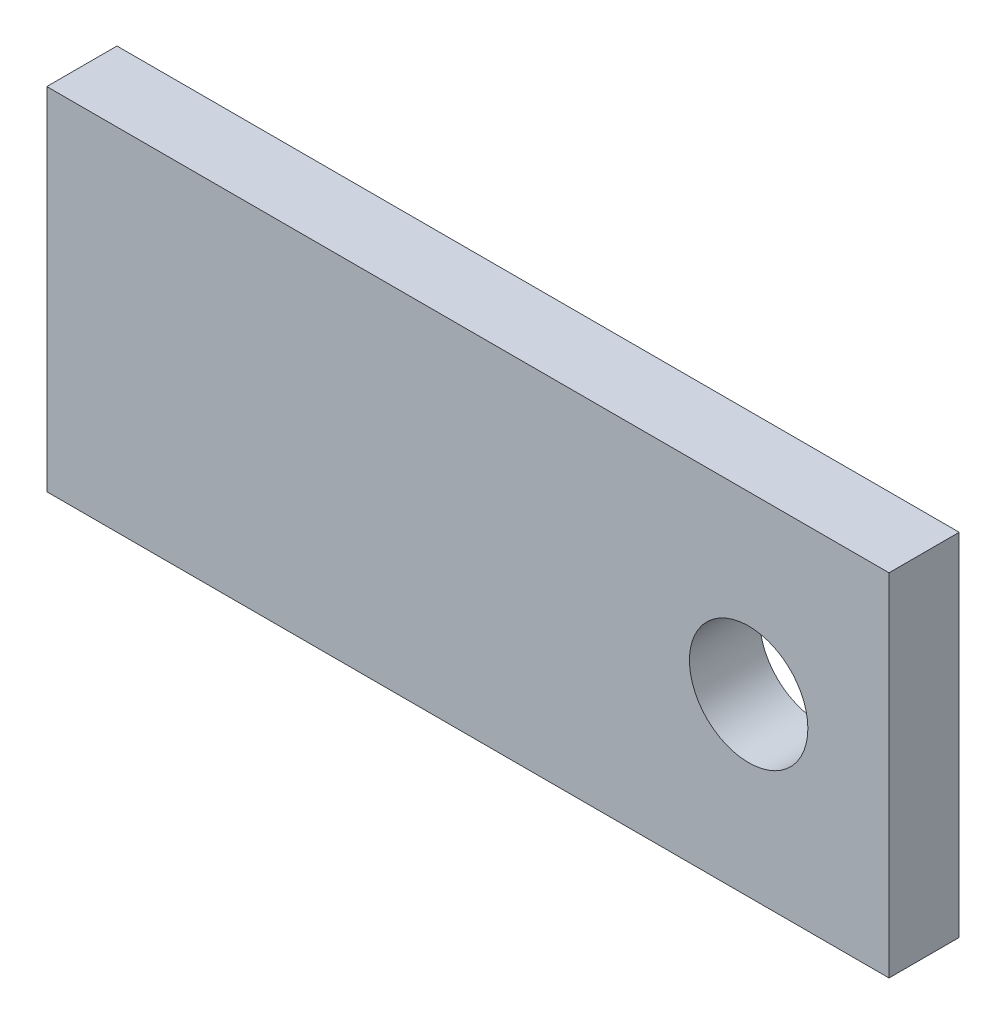
ISO-10303-21;
HEADER;
FILE_DESCRIPTION(('STEP AP214'),'2;1');
FILE_NAME('part.step','',(''),(''),'','','');
FILE_SCHEMA(('AUTOMOTIVE_DESIGN { 1 0 10303 214 1 1 1 1 }'));
ENDSEC;
DATA;
#1=APPLICATION_CONTEXT('core data for automotive mechanical design processes');
#2=APPLICATION_PROTOCOL_DEFINITION('international standard','automotive_design',2000,#1);
#3=PRODUCT_CONTEXT('',#1,'mechanical');
#4=PRODUCT('Part','Part','',(#3));
#5=PRODUCT_RELATED_PRODUCT_CATEGORY('part','',(#4));
#6=PRODUCT_DEFINITION_FORMATION('','',#4);
#7=PRODUCT_DEFINITION_CONTEXT('part definition',#1,'design');
#8=PRODUCT_DEFINITION('design','',#6,#7);
#9=PRODUCT_DEFINITION_SHAPE('','',#8);
#10=(LENGTH_UNIT() NAMED_UNIT(*) SI_UNIT(.MILLI.,.METRE.));
#11=(NAMED_UNIT(*) PLANE_ANGLE_UNIT() SI_UNIT($,.RADIAN.));
#12=(NAMED_UNIT(*) SI_UNIT($,.STERADIAN.) SOLID_ANGLE_UNIT());
#13=UNCERTAINTY_MEASURE_WITH_UNIT(LENGTH_MEASURE(1.E-05),#10,'distance_accuracy_value','');
#14=(GEOMETRIC_REPRESENTATION_CONTEXT(3) GLOBAL_UNCERTAINTY_ASSIGNED_CONTEXT((#13)) GLOBAL_UNIT_ASSIGNED_CONTEXT((#10,
#11,#12)) REPRESENTATION_CONTEXT('',''));
#15=CARTESIAN_POINT('',(0.,0.,0.));
#16=DIRECTION('',(0.,0.,1.));
#17=DIRECTION('',(1.,0.,0.));
#18=AXIS2_PLACEMENT_3D('',#15,#16,#17);
#19=CARTESIAN_POINT('',(38.1,-15.875,3.175));
#20=DIRECTION('',(-1.,0.,0.));
#21=DIRECTION('',(0.,0.,1.));
#22=AXIS2_PLACEMENT_3D('',#19,#20,#21);
#23=PLANE('',#22);
#24=DIRECTION('',(0.,1.,0.));
#25=VECTOR('',#24,1.);
#26=CARTESIAN_POINT('',(38.1,-15.875,-3.175));
#27=LINE('',#26,#25);
#28=CARTESIAN_POINT('',(38.1,-15.875,-3.175));
#29=VERTEX_POINT('',#28);
#30=CARTESIAN_POINT('',(38.1,15.875,-3.175));
#31=VERTEX_POINT('',#30);
#32=EDGE_CURVE('E96',#29,#31,#27,.T.);
#33=ORIENTED_EDGE('',*,*,#32,.T.);
#34=DIRECTION('',(0.,0.,-1.));
#35=VECTOR('',#34,1.);
#36=CARTESIAN_POINT('',(38.1,15.875,3.175));
#37=LINE('',#36,#35);
#38=CARTESIAN_POINT('',(38.1,15.875,3.175));
#39=VERTEX_POINT('',#38);
#40=EDGE_CURVE('E11',#39,#31,#37,.T.);
#41=ORIENTED_EDGE('',*,*,#40,.F.);
#42=DIRECTION('',(0.,1.,0.));
#43=VECTOR('',#42,1.);
#44=CARTESIAN_POINT('',(38.1,-15.875,3.175));
#45=LINE('',#44,#43);
#46=CARTESIAN_POINT('',(38.1,-15.875,3.175));
#47=VERTEX_POINT('',#46);
#48=EDGE_CURVE('E84',#47,#39,#45,.T.);
#49=ORIENTED_EDGE('',*,*,#48,.F.);
#50=DIRECTION('',(0.,0.,-1.));
#51=VECTOR('',#50,1.);
#52=CARTESIAN_POINT('',(38.1,-15.875,3.175));
#53=LINE('',#52,#51);
#54=EDGE_CURVE('E92',#47,#29,#53,.T.);
#55=ORIENTED_EDGE('',*,*,#54,.T.);
#56=EDGE_LOOP('',(#33,#41,#49,#55));
#57=FACE_BOUND('',#56,.T.);
#58=ADVANCED_FACE('F33',(#57),#23,.F.);
#59=CARTESIAN_POINT('',(-38.1,15.875,3.175));
#60=DIRECTION('',(0.,-1.,0.));
#61=DIRECTION('',(0.,0.,-1.));
#62=AXIS2_PLACEMENT_3D('',#59,#60,#61);
#63=PLANE('',#62);
#64=DIRECTION('',(-1.,0.,0.));
#65=VECTOR('',#64,1.);
#66=CARTESIAN_POINT('',(-38.1,15.875,-3.175));
#67=LINE('',#66,#65);
#68=CARTESIAN_POINT('',(-38.1,15.875,-3.175));
#69=VERTEX_POINT('',#68);
#70=EDGE_CURVE('E88',#31,#69,#67,.T.);
#71=ORIENTED_EDGE('',*,*,#70,.T.);
#72=DIRECTION('',(0.,0.,-1.));
#73=VECTOR('',#72,1.);
#74=CARTESIAN_POINT('',(-38.1,15.875,3.175));
#75=LINE('',#74,#73);
#76=CARTESIAN_POINT('',(-38.1,15.875,3.175));
#77=VERTEX_POINT('',#76);
#78=EDGE_CURVE('E41',#77,#69,#75,.T.);
#79=ORIENTED_EDGE('',*,*,#78,.F.);
#80=DIRECTION('',(-1.,0.,0.));
#81=VECTOR('',#80,1.);
#82=CARTESIAN_POINT('',(-38.1,15.875,3.175));
#83=LINE('',#82,#81);
#84=EDGE_CURVE('E79',#39,#77,#83,.T.);
#85=ORIENTED_EDGE('',*,*,#84,.F.);
#86=ORIENTED_EDGE('',*,*,#40,.T.);
#87=EDGE_LOOP('',(#71,#79,#85,#86));
#88=FACE_BOUND('',#87,.T.);
#89=ADVANCED_FACE('F87',(#88),#63,.F.);
#90=CARTESIAN_POINT('',(-38.1,-15.875,3.175));
#91=DIRECTION('',(1.,0.,0.));
#92=DIRECTION('',(0.,0.,-1.));
#93=AXIS2_PLACEMENT_3D('',#90,#91,#92);
#94=PLANE('',#93);
#95=DIRECTION('',(0.,-1.,0.));
#96=VECTOR('',#95,1.);
#97=CARTESIAN_POINT('',(-38.1,-15.875,-3.175));
#98=LINE('',#97,#96);
#99=CARTESIAN_POINT('',(-38.1,-15.875,-3.175));
#100=VERTEX_POINT('',#99);
#101=EDGE_CURVE('E66',#69,#100,#98,.T.);
#102=ORIENTED_EDGE('',*,*,#101,.T.);
#103=DIRECTION('',(0.,0.,-1.));
#104=VECTOR('',#103,1.);
#105=CARTESIAN_POINT('',(-38.1,-15.875,3.175));
#106=LINE('',#105,#104);
#107=CARTESIAN_POINT('',(-38.1,-15.875,3.175));
#108=VERTEX_POINT('',#107);
#109=EDGE_CURVE('E89',#108,#100,#106,.T.);
#110=ORIENTED_EDGE('',*,*,#109,.F.);
#111=DIRECTION('',(0.,-1.,0.));
#112=VECTOR('',#111,1.);
#113=CARTESIAN_POINT('',(-38.1,-15.875,3.175));
#114=LINE('',#113,#112);
#115=EDGE_CURVE('E82',#77,#108,#114,.T.);
#116=ORIENTED_EDGE('',*,*,#115,.F.);
#117=ORIENTED_EDGE('',*,*,#78,.T.);
#118=EDGE_LOOP('',(#102,#110,#116,#117));
#119=FACE_BOUND('',#118,.T.);
#120=ADVANCED_FACE('F90',(#119),#94,.F.);
#121=CARTESIAN_POINT('',(-38.1,-15.875,3.175));
#122=DIRECTION('',(0.,1.,0.));
#123=DIRECTION('',(0.,0.,1.));
#124=AXIS2_PLACEMENT_3D('',#121,#122,#123);
#125=PLANE('',#124);
#126=DIRECTION('',(1.,0.,0.));
#127=VECTOR('',#126,1.);
#128=CARTESIAN_POINT('',(-38.1,-15.875,-3.175));
#129=LINE('',#128,#127);
#130=EDGE_CURVE('E72',#100,#29,#129,.T.);
#131=ORIENTED_EDGE('',*,*,#130,.T.);
#132=ORIENTED_EDGE('',*,*,#54,.F.);
#133=DIRECTION('',(1.,0.,0.));
#134=VECTOR('',#133,1.);
#135=CARTESIAN_POINT('',(-38.1,-15.875,3.175));
#136=LINE('',#135,#134);
#137=EDGE_CURVE('E49',#108,#47,#136,.T.);
#138=ORIENTED_EDGE('',*,*,#137,.F.);
#139=ORIENTED_EDGE('',*,*,#109,.T.);
#140=EDGE_LOOP('',(#131,#132,#138,#139));
#141=FACE_BOUND('',#140,.T.);
#142=ADVANCED_FACE('F104',(#141),#125,.F.);
#143=CARTESIAN_POINT('',(38.1,15.875,3.175));
#144=DIRECTION('',(0.,0.,-1.));
#145=DIRECTION('',(-1.,0.,0.));
#146=AXIS2_PLACEMENT_3D('',#143,#144,#145);
#147=PLANE('',#146);
#148=CARTESIAN_POINT('',(25.4,0.,3.175));
#149=DIRECTION('',(0.,0.,1.));
#150=DIRECTION('',(1.,0.,0.));
#151=AXIS2_PLACEMENT_3D('',#148,#149,#150);
#152=CIRCLE('',#151,5.357876);
#153=CARTESIAN_POINT('',(30.757876,0.,3.175));
#154=VERTEX_POINT('',#153);
#155=EDGE_CURVE('E112',#154,#154,#152,.T.);
#156=ORIENTED_EDGE('',*,*,#155,.F.);
#157=EDGE_LOOP('',(#156));
#158=FACE_BOUND('',#157,.T.);
#159=ORIENTED_EDGE('',*,*,#48,.T.);
#160=ORIENTED_EDGE('',*,*,#84,.T.);
#161=ORIENTED_EDGE('',*,*,#115,.T.);
#162=ORIENTED_EDGE('',*,*,#137,.T.);
#163=EDGE_LOOP('',(#159,#160,#161,#162));
#164=FACE_BOUND('',#163,.T.);
#165=ADVANCED_FACE('F80',(#158,#164),#147,.F.);
#166=CARTESIAN_POINT('',(38.1,15.875,-3.175));
#167=DIRECTION('',(0.,0.,-1.));
#168=DIRECTION('',(-1.,0.,0.));
#169=AXIS2_PLACEMENT_3D('',#166,#167,#168);
#170=PLANE('',#169);
#171=CARTESIAN_POINT('',(25.4,0.,-3.175));
#172=DIRECTION('',(0.,0.,1.));
#173=DIRECTION('',(1.,0.,0.));
#174=AXIS2_PLACEMENT_3D('',#171,#172,#173);
#175=CIRCLE('',#174,5.357876);
#176=CARTESIAN_POINT('',(30.757876,0.,-3.175));
#177=VERTEX_POINT('',#176);
#178=EDGE_CURVE('E99',#177,#177,#175,.T.);
#179=ORIENTED_EDGE('',*,*,#178,.T.);
#180=EDGE_LOOP('',(#179));
#181=FACE_BOUND('',#180,.T.);
#182=ORIENTED_EDGE('',*,*,#32,.F.);
#183=ORIENTED_EDGE('',*,*,#130,.F.);
#184=ORIENTED_EDGE('',*,*,#101,.F.);
#185=ORIENTED_EDGE('',*,*,#70,.F.);
#186=EDGE_LOOP('',(#182,#183,#184,#185));
#187=FACE_BOUND('',#186,.T.);
#188=ADVANCED_FACE('F107',(#181,#187),#170,.T.);
#189=CARTESIAN_POINT('',(25.4,0.,3.175));
#190=DIRECTION('',(0.,0.,1.));
#191=DIRECTION('',(1.,0.,0.));
#192=AXIS2_PLACEMENT_3D('',#189,#190,#191);
#193=CYLINDRICAL_SURFACE('',#192,5.357876);
#194=ORIENTED_EDGE('',*,*,#178,.F.);
#195=EDGE_LOOP('',(#194));
#196=FACE_BOUND('',#195,.T.);
#197=ORIENTED_EDGE('',*,*,#155,.T.);
#198=EDGE_LOOP('',(#197));
#199=FACE_BOUND('',#198,.T.);
#200=ADVANCED_FACE('F116',(#196,#199),#193,.F.);
#201=CLOSED_SHELL('',(#58,#89,#120,#142,#165,#188,#200));
#202=MANIFOLD_SOLID_BREP('B2',#201);
#203=ADVANCED_BREP_SHAPE_REPRESENTATION('',(#18,#202),#14);
#204=SHAPE_DEFINITION_REPRESENTATION(#9,#203);
ENDSEC;
END-ISO-10303-21;
